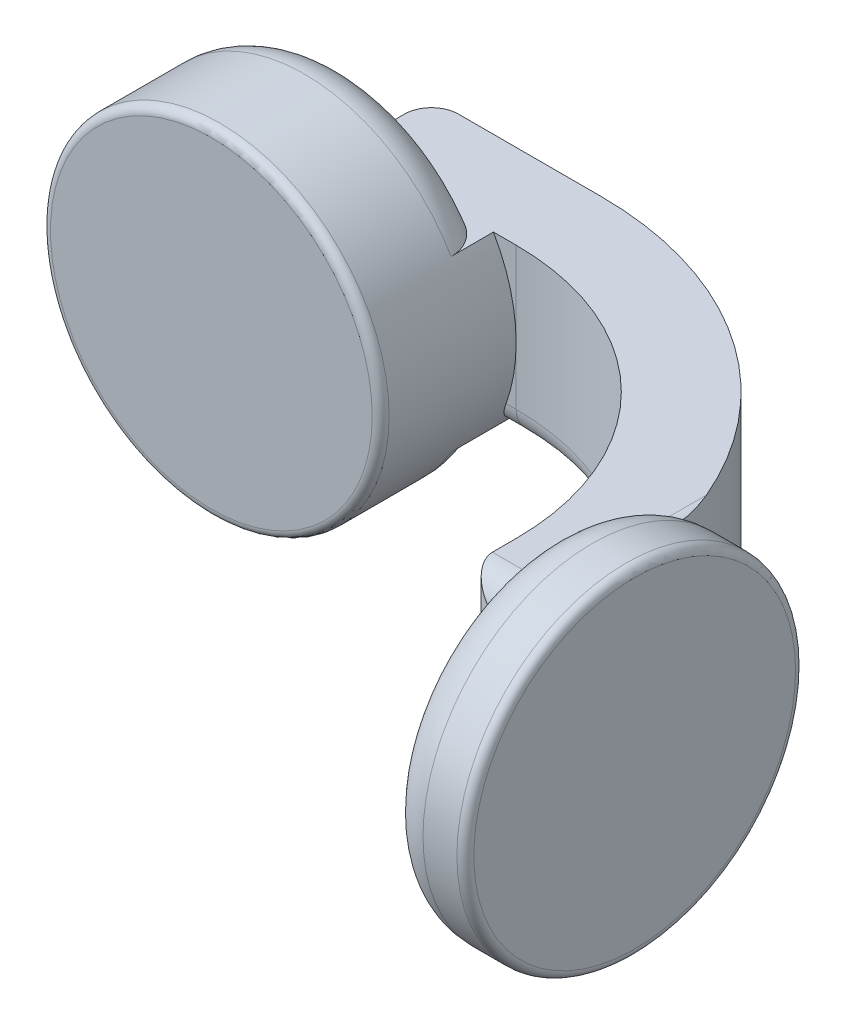
ISO-10303-21;
HEADER;
FILE_DESCRIPTION(('STEP AP214'),'2;1');
FILE_NAME('part.step','',(''),(''),'','','');
FILE_SCHEMA(('AUTOMOTIVE_DESIGN { 1 0 10303 214 1 1 1 1 }'));
ENDSEC;
DATA;
#1=APPLICATION_CONTEXT('core data for automotive mechanical design processes');
#2=APPLICATION_PROTOCOL_DEFINITION('international standard','automotive_design',2000,#1);
#3=PRODUCT_CONTEXT('',#1,'mechanical');
#4=PRODUCT('Part','Part','',(#3));
#5=PRODUCT_RELATED_PRODUCT_CATEGORY('part','',(#4));
#6=PRODUCT_DEFINITION_FORMATION('','',#4);
#7=PRODUCT_DEFINITION_CONTEXT('part definition',#1,'design');
#8=PRODUCT_DEFINITION('design','',#6,#7);
#9=PRODUCT_DEFINITION_SHAPE('','',#8);
#10=(LENGTH_UNIT() NAMED_UNIT(*) SI_UNIT(.MILLI.,.METRE.));
#11=(NAMED_UNIT(*) PLANE_ANGLE_UNIT() SI_UNIT($,.RADIAN.));
#12=(NAMED_UNIT(*) SI_UNIT($,.STERADIAN.) SOLID_ANGLE_UNIT());
#13=UNCERTAINTY_MEASURE_WITH_UNIT(LENGTH_MEASURE(1.E-05),#10,'distance_accuracy_value','');
#14=(GEOMETRIC_REPRESENTATION_CONTEXT(3) GLOBAL_UNCERTAINTY_ASSIGNED_CONTEXT((#13)) GLOBAL_UNIT_ASSIGNED_CONTEXT((#10,
#11,#12)) REPRESENTATION_CONTEXT('',''));
#15=CARTESIAN_POINT('',(0.,0.,0.));
#16=DIRECTION('',(0.,0.,1.));
#17=DIRECTION('',(1.,0.,0.));
#18=AXIS2_PLACEMENT_3D('',#15,#16,#17);
#19=CARTESIAN_POINT('',(0.,0.,0.));
#20=DIRECTION('',(0.,0.,1.));
#21=DIRECTION('',(1.,0.,0.));
#22=AXIS2_PLACEMENT_3D('',#19,#20,#21);
#23=PLANE('',#22);
#24=DIRECTION('',(1.,0.,0.));
#25=VECTOR('',#24,1.);
#26=CARTESIAN_POINT('',(10.,-5.,0.));
#27=LINE('',#26,#25);
#28=CARTESIAN_POINT('',(0.,-5.,0.));
#29=VERTEX_POINT('',#28);
#30=CARTESIAN_POINT('',(5.59016994374947,-5.,0.));
#31=VERTEX_POINT('',#30);
#32=EDGE_CURVE('E369',#29,#31,#27,.T.);
#33=ORIENTED_EDGE('',*,*,#32,.T.);
#34=CARTESIAN_POINT('',(0.,0.,0.));
#35=DIRECTION('',(0.,0.,1.));
#36=DIRECTION('',(1.,0.,0.));
#37=AXIS2_PLACEMENT_3D('',#34,#35,#36);
#38=CIRCLE('',#37,7.5);
#39=CARTESIAN_POINT('',(5.59016994374947,5.,0.));
#40=VERTEX_POINT('',#39);
#41=EDGE_CURVE('E384',#31,#40,#38,.F.);
#42=ORIENTED_EDGE('',*,*,#41,.T.);
#43=DIRECTION('',(1.,0.,0.));
#44=VECTOR('',#43,1.);
#45=CARTESIAN_POINT('',(10.,5.,0.));
#46=LINE('',#45,#44);
#47=CARTESIAN_POINT('',(0.,5.,0.));
#48=VERTEX_POINT('',#47);
#49=EDGE_CURVE('E191',#48,#40,#46,.T.);
#50=ORIENTED_EDGE('',*,*,#49,.F.);
#51=DIRECTION('',(0.,-1.,0.));
#52=VECTOR('',#51,1.);
#53=CARTESIAN_POINT('',(0.,5.,0.));
#54=LINE('',#53,#52);
#55=EDGE_CURVE('E395',#48,#29,#54,.T.);
#56=ORIENTED_EDGE('',*,*,#55,.T.);
#57=EDGE_LOOP('',(#33,#42,#50,#56));
#58=FACE_BOUND('',#57,.T.);
#59=ADVANCED_FACE('F45',(#58),#23,.F.);
#60=CARTESIAN_POINT('',(0.,0.,8.));
#61=DIRECTION('',(0.,0.,-1.));
#62=DIRECTION('',(-1.,0.,0.));
#63=AXIS2_PLACEMENT_3D('',#60,#61,#62);
#64=CYLINDRICAL_SURFACE('',#63,10.);
#65=CARTESIAN_POINT('',(0.,0.,7.5));
#66=DIRECTION('',(0.,0.,1.));
#67=DIRECTION('',(1.,0.,0.));
#68=AXIS2_PLACEMENT_3D('',#65,#66,#67);
#69=CIRCLE('',#68,10.);
#70=CARTESIAN_POINT('',(10.,0.,7.5));
#71=VERTEX_POINT('',#70);
#72=EDGE_CURVE('E482',#71,#71,#69,.F.);
#73=ORIENTED_EDGE('',*,*,#72,.T.);
#74=EDGE_LOOP('',(#73));
#75=FACE_BOUND('',#74,.T.);
#76=CARTESIAN_POINT('',(0.,0.,2.5));
#77=DIRECTION('',(0.,0.,1.));
#78=DIRECTION('',(1.,0.,0.));
#79=AXIS2_PLACEMENT_3D('',#76,#77,#78);
#80=CIRCLE('',#79,10.);
#81=CARTESIAN_POINT('',(8.66025403784439,5.,2.5));
#82=VERTEX_POINT('',#81);
#83=CARTESIAN_POINT('',(8.66025403784439,-5.,2.5));
#84=VERTEX_POINT('',#83);
#85=EDGE_CURVE('E382',#82,#84,#80,.T.);
#86=ORIENTED_EDGE('',*,*,#85,.T.);
#87=DIRECTION('',(0.,0.,-1.));
#88=VECTOR('',#87,1.);
#89=CARTESIAN_POINT('',(8.66025403784439,-5.,-1.6));
#90=LINE('',#89,#88);
#91=CARTESIAN_POINT('',(8.66025403784439,-5.,-1.6));
#92=VERTEX_POINT('',#91);
#93=EDGE_CURVE('E224',#92,#84,#90,.F.);
#94=ORIENTED_EDGE('',*,*,#93,.F.);
#95=CARTESIAN_POINT('',(8.66025403784439,-5.,-1.6));
#96=CARTESIAN_POINT('',(8.66025058169647,-5.00000266553729,-1.55887486618743));
#97=CARTESIAN_POINT('',(8.66117031444585,-4.9984132742453,-1.51777182963265));
#98=CARTESIAN_POINT('',(8.66481595063756,-4.99209221600678,-1.4359057856771));
#99=CARTESIAN_POINT('',(8.66754109183755,-4.98736187516532,-1.39514264212504));
#100=CARTESIAN_POINT('',(8.67832434041152,-4.96859184005911,-1.27421645717147));
#101=CARTESIAN_POINT('',(8.68899125727863,-4.94997202182349,-1.19494076642093));
#102=CARTESIAN_POINT('',(8.71646175302994,-4.90143425043169,-1.04125441294594));
#103=CARTESIAN_POINT('',(8.73325760344918,-4.87153052445072,-0.966837761786034));
#104=CARTESIAN_POINT('',(8.77188835727099,-4.80162123107177,-0.824262313424807));
#105=CARTESIAN_POINT('',(8.79372865329682,-4.76160484868106,-0.756110323065679));
#106=CARTESIAN_POINT('',(8.84275107076229,-4.66996936590311,-0.623218899185277));
#107=CARTESIAN_POINT('',(8.87018425017985,-4.61777505819111,-0.558970581843785));
#108=CARTESIAN_POINT('',(8.92801121418124,-4.50495689174365,-0.43991236217558));
#109=CARTESIAN_POINT('',(8.95840621253011,-4.44432957273975,-0.385106355027962));
#110=CARTESIAN_POINT('',(9.02473551105434,-4.3081949789312,-0.279593806323518));
#111=CARTESIAN_POINT('',(9.06089321781526,-4.23177472704241,-0.230203030543564));
#112=CARTESIAN_POINT('',(9.13383831521475,-4.07194398479078,-0.145114679299862));
#113=CARTESIAN_POINT('',(9.17062574000854,-3.98853311430253,-0.109417849054415));
#114=CARTESIAN_POINT('',(9.24115197100165,-3.82213169028326,-0.0543687952959192));
#115=CARTESIAN_POINT('',(9.27493486529865,-3.73945799539497,-0.0341143164682533));
#116=CARTESIAN_POINT('',(9.34097034296012,-3.57136092533112,-0.00692002501543537));
#117=CARTESIAN_POINT('',(9.37322286819497,-3.48593744591412,1.92822397724234E-05));
#118=CARTESIAN_POINT('',(9.404254356407,-3.4,0.));
#119=B_SPLINE_CURVE_WITH_KNOTS('',3,(#95,#96,#97,#98,#99,#100,#101,#102,#103,#104,#105,#106,
#107,#108,#109,#110,#111,#112,#113,#114,#115,#116,#117,#118),.UNSPECIFIED.,.F.,.F.,(4,2,2,2,2,2,
2,2,2,2,2,4),(0.,0.123291745203294,0.246531469851398,0.491603138959555,0.736366839400012,
0.981393418694913,1.24197132581496,1.50265647150607,1.79514368853533,2.08764682032895,
2.3613697328088,2.63510303408434),.UNSPECIFIED.);
#120=CARTESIAN_POINT('',(9.404254356407,-3.4,0.));
#121=VERTEX_POINT('',#120);
#122=EDGE_CURVE('E240',#92,#121,#119,.T.);
#123=ORIENTED_EDGE('',*,*,#122,.T.);
#124=CARTESIAN_POINT('',(0.,0.,0.));
#125=DIRECTION('',(0.,0.,1.));
#126=DIRECTION('',(1.,0.,0.));
#127=AXIS2_PLACEMENT_3D('',#124,#125,#126);
#128=CIRCLE('',#127,10.);
#129=CARTESIAN_POINT('',(10.,0.,0.));
#130=VERTEX_POINT('',#129);
#131=EDGE_CURVE('E207',#121,#130,#128,.T.);
#132=ORIENTED_EDGE('',*,*,#131,.T.);
#133=CARTESIAN_POINT('',(8.66025403784439,5.,0.));
#134=VERTEX_POINT('',#133);
#135=EDGE_CURVE('E205',#130,#134,#128,.T.);
#136=ORIENTED_EDGE('',*,*,#135,.T.);
#137=DIRECTION('',(0.,0.,-1.));
#138=VECTOR('',#137,1.);
#139=CARTESIAN_POINT('',(8.66025403784439,5.,0.));
#140=LINE('',#139,#138);
#141=EDGE_CURVE('E186',#134,#82,#140,.F.);
#142=ORIENTED_EDGE('',*,*,#141,.T.);
#143=EDGE_LOOP('',(#86,#94,#123,#132,#136,#142));
#144=FACE_BOUND('',#143,.T.);
#145=ADVANCED_FACE('F251',(#75,#144),#64,.T.);
#146=CARTESIAN_POINT('',(0.,0.,8.));
#147=DIRECTION('',(0.,0.,1.));
#148=DIRECTION('',(1.,0.,0.));
#149=AXIS2_PLACEMENT_3D('',#146,#147,#148);
#150=PLANE('',#149);
#151=CARTESIAN_POINT('',(0.,0.,8.));
#152=DIRECTION('',(0.,0.,1.));
#153=DIRECTION('',(1.,0.,0.));
#154=AXIS2_PLACEMENT_3D('',#151,#152,#153);
#155=CIRCLE('',#154,9.5);
#156=CARTESIAN_POINT('',(9.5,0.,8.));
#157=VERTEX_POINT('',#156);
#158=EDGE_CURVE('E877',#157,#157,#155,.T.);
#159=ORIENTED_EDGE('',*,*,#158,.T.);
#160=EDGE_LOOP('',(#159));
#161=FACE_BOUND('',#160,.T.);
#162=ADVANCED_FACE('F508',(#161),#150,.T.);
#163=CARTESIAN_POINT('',(10.,5.,0.));
#164=DIRECTION('',(0.,0.,-1.));
#165=DIRECTION('',(-1.,0.,0.));
#166=AXIS2_PLACEMENT_3D('',#163,#164,#165);
#167=PLANE('',#166);
#168=CARTESIAN_POINT('',(10.,5.,0.));
#169=VERTEX_POINT('',#168);
#170=EDGE_CURVE('E179',#134,#169,#46,.T.);
#171=ORIENTED_EDGE('',*,*,#170,.F.);
#172=ORIENTED_EDGE('',*,*,#135,.F.);
#173=DIRECTION('',(0.,-1.,0.));
#174=VECTOR('',#173,1.);
#175=CARTESIAN_POINT('',(10.,5.,0.));
#176=LINE('',#175,#174);
#177=EDGE_CURVE('E198',#169,#130,#176,.T.);
#178=ORIENTED_EDGE('',*,*,#177,.F.);
#179=EDGE_LOOP('',(#171,#172,#178));
#180=FACE_BOUND('',#179,.T.);
#181=ADVANCED_FACE('F204',(#180),#167,.F.);
#182=ORIENTED_EDGE('',*,*,#131,.F.);
#183=DIRECTION('',(1.,0.,0.));
#184=VECTOR('',#183,1.);
#185=CARTESIAN_POINT('',(10.,-3.4,0.));
#186=LINE('',#185,#184);
#187=CARTESIAN_POINT('',(10.,-3.4,0.));
#188=VERTEX_POINT('',#187);
#189=EDGE_CURVE('E214',#121,#188,#186,.T.);
#190=ORIENTED_EDGE('',*,*,#189,.T.);
#191=EDGE_CURVE('E208',#130,#188,#176,.T.);
#192=ORIENTED_EDGE('',*,*,#191,.F.);
#193=EDGE_LOOP('',(#182,#190,#192));
#194=FACE_BOUND('',#193,.T.);
#195=ADVANCED_FACE('F401',(#194),#167,.F.);
#196=CARTESIAN_POINT('',(10.,5.,15.));
#197=DIRECTION('',(0.,-1.,0.));
#198=DIRECTION('',(0.,0.,-1.));
#199=AXIS2_PLACEMENT_3D('',#196,#197,#198);
#200=CYLINDRICAL_SURFACE('',#199,15.);
#201=ORIENTED_EDGE('',*,*,#191,.T.);
#202=CARTESIAN_POINT('',(10.,-3.4,15.));
#203=DIRECTION('',(0.,-1.,0.));
#204=DIRECTION('',(0.,0.,-1.));
#205=AXIS2_PLACEMENT_3D('',#202,#203,#204);
#206=CIRCLE('',#205,15.);
#207=CARTESIAN_POINT('',(25.,-3.4,15.));
#208=VERTEX_POINT('',#207);
#209=EDGE_CURVE('E238',#188,#208,#206,.T.);
#210=ORIENTED_EDGE('',*,*,#209,.T.);
#211=DIRECTION('',(0.,-1.,0.));
#212=VECTOR('',#211,1.);
#213=CARTESIAN_POINT('',(25.,5.,15.));
#214=LINE('',#213,#212);
#215=CARTESIAN_POINT('',(25.,5.,15.));
#216=VERTEX_POINT('',#215);
#217=EDGE_CURVE('E200',#216,#208,#214,.T.);
#218=ORIENTED_EDGE('',*,*,#217,.F.);
#219=CARTESIAN_POINT('',(10.,5.,15.));
#220=DIRECTION('',(0.,-1.,0.));
#221=DIRECTION('',(0.,0.,1.));
#222=AXIS2_PLACEMENT_3D('',#219,#220,#221);
#223=CIRCLE('',#222,15.);
#224=EDGE_CURVE('E183',#169,#216,#223,.T.);
#225=ORIENTED_EDGE('',*,*,#224,.F.);
#226=ORIENTED_EDGE('',*,*,#177,.T.);
#227=EDGE_LOOP('',(#201,#210,#218,#225,#226));
#228=FACE_BOUND('',#227,.T.);
#229=ADVANCED_FACE('F197',(#228),#200,.F.);
#230=CARTESIAN_POINT('',(25.,5.,18.));
#231=DIRECTION('',(1.,0.,0.));
#232=DIRECTION('',(0.,0.,-1.));
#233=AXIS2_PLACEMENT_3D('',#230,#231,#232);
#234=PLANE('',#233);
#235=DIRECTION('',(0.,0.,1.));
#236=VECTOR('',#235,1.);
#237=CARTESIAN_POINT('',(25.,-3.4,18.));
#238=LINE('',#237,#236);
#239=CARTESIAN_POINT('',(25.,-3.4,16.4));
#240=VERTEX_POINT('',#239);
#241=EDGE_CURVE('E228',#208,#240,#238,.T.);
#242=ORIENTED_EDGE('',*,*,#241,.T.);
#243=DIRECTION('',(0.,-1.,0.));
#244=VECTOR('',#243,1.);
#245=CARTESIAN_POINT('',(25.,5.,16.4));
#246=LINE('',#245,#244);
#247=CARTESIAN_POINT('',(25.,5.,16.4));
#248=VERTEX_POINT('',#247);
#249=EDGE_CURVE('E415',#240,#248,#246,.F.);
#250=ORIENTED_EDGE('',*,*,#249,.T.);
#251=DIRECTION('',(0.,0.,1.));
#252=VECTOR('',#251,1.);
#253=CARTESIAN_POINT('',(25.,5.,18.));
#254=LINE('',#253,#252);
#255=EDGE_CURVE('E202',#216,#248,#254,.T.);
#256=ORIENTED_EDGE('',*,*,#255,.F.);
#257=ORIENTED_EDGE('',*,*,#217,.T.);
#258=EDGE_LOOP('',(#242,#250,#256,#257));
#259=FACE_BOUND('',#258,.T.);
#260=ADVANCED_FACE('F404',(#259),#234,.F.);
#261=CARTESIAN_POINT('',(30.,5.,18.));
#262=DIRECTION('',(0.,0.,-1.));
#263=DIRECTION('',(-1.,0.,0.));
#264=AXIS2_PLACEMENT_3D('',#261,#262,#263);
#265=PLANE('',#264);
#266=DIRECTION('',(1.,0.,0.));
#267=VECTOR('',#266,1.);
#268=CARTESIAN_POINT('',(30.,3.4,18.));
#269=LINE('',#268,#267);
#270=CARTESIAN_POINT('',(28.4,3.4,18.));
#271=VERTEX_POINT('',#270);
#272=CARTESIAN_POINT('',(26.6,3.4,18.));
#273=VERTEX_POINT('',#272);
#274=EDGE_CURVE('E474',#271,#273,#269,.F.);
#275=ORIENTED_EDGE('',*,*,#274,.T.);
#276=DIRECTION('',(0.,-1.,0.));
#277=VECTOR('',#276,1.);
#278=CARTESIAN_POINT('',(26.6,5.,18.));
#279=LINE('',#278,#277);
#280=CARTESIAN_POINT('',(26.6,-3.4,18.));
#281=VERTEX_POINT('',#280);
#282=EDGE_CURVE('E419',#273,#281,#279,.T.);
#283=ORIENTED_EDGE('',*,*,#282,.T.);
#284=DIRECTION('',(1.,0.,0.));
#285=VECTOR('',#284,1.);
#286=CARTESIAN_POINT('',(30.,-3.4,18.));
#287=LINE('',#286,#285);
#288=CARTESIAN_POINT('',(28.4,-3.4,18.));
#289=VERTEX_POINT('',#288);
#290=EDGE_CURVE('E478',#281,#289,#287,.T.);
#291=ORIENTED_EDGE('',*,*,#290,.T.);
#292=DIRECTION('',(0.,-1.,0.));
#293=VECTOR('',#292,1.);
#294=CARTESIAN_POINT('',(28.4,5.,18.));
#295=LINE('',#294,#293);
#296=EDGE_CURVE('E479',#289,#271,#295,.F.);
#297=ORIENTED_EDGE('',*,*,#296,.T.);
#298=EDGE_LOOP('',(#275,#283,#291,#297));
#299=FACE_BOUND('',#298,.T.);
#300=ADVANCED_FACE('F324',(#299),#265,.F.);
#301=CARTESIAN_POINT('',(10.,5.,15.));
#302=DIRECTION('',(0.,-1.,0.));
#303=DIRECTION('',(0.,0.,-1.));
#304=AXIS2_PLACEMENT_3D('',#301,#302,#303);
#305=CYLINDRICAL_SURFACE('',#304,20.);
#306=DIRECTION('',(0.,-1.,0.));
#307=VECTOR('',#306,1.);
#308=CARTESIAN_POINT('',(30.,5.,15.));
#309=LINE('',#308,#307);
#310=CARTESIAN_POINT('',(30.,6.6,15.));
#311=VERTEX_POINT('',#310);
#312=CARTESIAN_POINT('',(30.,-6.6,15.));
#313=VERTEX_POINT('',#312);
#314=EDGE_CURVE('E407',#311,#313,#309,.T.);
#315=ORIENTED_EDGE('',*,*,#314,.T.);
#316=CARTESIAN_POINT('',(28.4,-5.,7.16163282309384));
#317=CARTESIAN_POINT('',(28.4530484699294,-5.00002068483299,7.286155366446));
#318=CARTESIAN_POINT('',(28.5048200993728,-5.00263727314712,7.41119605520283));
#319=CARTESIAN_POINT('',(28.605742286896,-5.01246853776342,7.66211109644269));
#320=CARTESIAN_POINT('',(28.6548936310212,-5.01968182661868,7.78798518603461));
#321=CARTESIAN_POINT('',(28.7504717643221,-5.03810036501447,8.04025981820502));
#322=CARTESIAN_POINT('',(28.7969023370756,-5.04929990997424,8.16665935467843));
#323=CARTESIAN_POINT('',(28.8870956091202,-5.0752249020843,8.42005250289731));
#324=CARTESIAN_POINT('',(28.9308580760043,-5.08995065583822,8.54704616536004));
#325=CARTESIAN_POINT('',(29.0578700419348,-5.13869005956199,8.92800714384153));
#326=CARTESIAN_POINT('',(29.1371368543709,-5.17732758481859,9.18272806205544));
#327=CARTESIAN_POINT('',(29.285059588997,-5.26432532093026,9.69365649505783));
#328=CARTESIAN_POINT('',(29.3537103002799,-5.3126902798639,9.94986467625656));
#329=CARTESIAN_POINT('',(29.5144255660816,-5.44502383097576,10.6008999398467));
#330=CARTESIAN_POINT('',(29.5993328896146,-5.5341860957001,10.9964626006848));
#331=CARTESIAN_POINT('',(29.7446756716351,-5.72467494915188,11.7890387753721));
#332=CARTESIAN_POINT('',(29.8051060263866,-5.82600406910742,12.1860525744055));
#333=CARTESIAN_POINT('',(29.9502596230999,-6.14143093440387,13.3787422174128));
#334=CARTESIAN_POINT('',(29.9988979049005,-6.36701704803795,14.1762812374318));
#335=CARTESIAN_POINT('',(29.9999938236233,-6.59486805700754,14.9818557642076));
#336=CARTESIAN_POINT('',(29.9999999961886,-6.59743405958099,14.9909279519622));
#337=CARTESIAN_POINT('',(30.,-6.6,15.));
#338=B_SPLINE_CURVE_WITH_KNOTS('',3,(#316,#317,#318,#319,#320,#321,#322,#323,#324,#325,#326,
#327,#328,#329,#330,#331,#332,#333,#334,#335,#336,#337),.UNSPECIFIED.,.F.,.F.,(4,2,2,2,2,2,2,2,
2,2,4),(0.,0.405988217514378,0.811853951420562,1.21714118612728,1.62246367333657,
2.43062470155256,3.23918116453678,4.48086558408027,5.72280877632142,8.20601964192417,
8.23430391923559),.UNSPECIFIED.);
#339=CARTESIAN_POINT('',(28.4,-5.,7.16163282309384));
#340=VERTEX_POINT('',#339);
#341=EDGE_CURVE('E11',#313,#340,#338,.F.);
#342=ORIENTED_EDGE('',*,*,#341,.T.);
#343=CARTESIAN_POINT('',(10.,-5.,15.));
#344=DIRECTION('',(0.,1.,0.));
#345=DIRECTION('',(0.,0.,-1.));
#346=AXIS2_PLACEMENT_3D('',#343,#344,#345);
#347=CIRCLE('',#346,20.);
#348=CARTESIAN_POINT('',(10.,-5.,-5.));
#349=VERTEX_POINT('',#348);
#350=EDGE_CURVE('E373',#340,#349,#347,.T.);
#351=ORIENTED_EDGE('',*,*,#350,.T.);
#352=DIRECTION('',(0.,-1.,0.));
#353=VECTOR('',#352,1.);
#354=CARTESIAN_POINT('',(10.,5.,-5.));
#355=LINE('',#354,#353);
#356=CARTESIAN_POINT('',(10.,5.,-5.));
#357=VERTEX_POINT('',#356);
#358=EDGE_CURVE('E450',#357,#349,#355,.T.);
#359=ORIENTED_EDGE('',*,*,#358,.F.);
#360=CARTESIAN_POINT('',(10.,5.,15.));
#361=DIRECTION('',(0.,1.,0.));
#362=DIRECTION('',(0.,0.,-1.));
#363=AXIS2_PLACEMENT_3D('',#360,#361,#362);
#364=CIRCLE('',#363,20.);
#365=CARTESIAN_POINT('',(28.4,5.,7.16163282309384));
#366=VERTEX_POINT('',#365);
#367=EDGE_CURVE('E442',#366,#357,#364,.T.);
#368=ORIENTED_EDGE('',*,*,#367,.F.);
#369=CARTESIAN_POINT('',(28.4,5.,7.16163282309384));
#370=CARTESIAN_POINT('',(28.4530484699293,5.00002068483299,7.28615536644588));
#371=CARTESIAN_POINT('',(28.5048200993727,5.00263727314711,7.41119605520257));
#372=CARTESIAN_POINT('',(28.6057422868958,5.01246853776339,7.66211109644217));
#373=CARTESIAN_POINT('',(28.6548936310209,5.01968182661864,7.78798518603396));
#374=CARTESIAN_POINT('',(28.7504717643218,5.0381003650144,8.04025981820415));
#375=CARTESIAN_POINT('',(28.7969023370753,5.04929990997414,8.16665935467745));
#376=CARTESIAN_POINT('',(28.8870956091198,5.07522490208417,8.42005250289612));
#377=CARTESIAN_POINT('',(28.9308580760039,5.08995065583807,8.54704616535875));
#378=CARTESIAN_POINT('',(29.0578700419345,5.13869005956181,8.92800714384038));
#379=CARTESIAN_POINT('',(29.1371368543707,5.17732758481843,9.18272806205453));
#380=CARTESIAN_POINT('',(29.2850595889969,5.26432532093019,9.69365649505739));
#381=CARTESIAN_POINT('',(29.3537103002799,5.31269027986392,9.94986467625632));
#382=CARTESIAN_POINT('',(29.5144255660816,5.44502383097565,10.6008999398467));
#383=CARTESIAN_POINT('',(29.5993328896146,5.53418609569961,10.996462600685));
#384=CARTESIAN_POINT('',(29.7446756716351,5.72467494915242,11.7890387753722));
#385=CARTESIAN_POINT('',(29.8051060263866,5.82600406910935,12.1860525744053));
#386=CARTESIAN_POINT('',(29.9502596230999,6.14143093440022,13.3787422174142));
#387=CARTESIAN_POINT('',(29.9988979049005,6.36701704801761,14.1762812374377));
#388=CARTESIAN_POINT('',(29.9999938236233,6.59486805700707,14.9818557642077));
#389=CARTESIAN_POINT('',(29.9999999961886,6.59743405958075,14.9909279519623));
#390=CARTESIAN_POINT('',(30.,6.6,15.));
#391=B_SPLINE_CURVE_WITH_KNOTS('',3,(#369,#370,#371,#372,#373,#374,#375,#376,#377,#378,#379,
#380,#381,#382,#383,#384,#385,#386,#387,#388,#389,#390),.UNSPECIFIED.,.F.,.F.,(4,2,2,2,2,2,2,2,
2,2,4),(0.,0.405988217513961,0.81185395141973,1.21714118612612,1.62246367333509,
2.43062470155186,3.23918116453678,4.4808655840804,5.72280877632186,8.20601964192418,
8.23430391923559),.UNSPECIFIED.);
#392=EDGE_CURVE('E55',#366,#311,#391,.T.);
#393=ORIENTED_EDGE('',*,*,#392,.T.);
#394=EDGE_LOOP('',(#315,#342,#351,#359,#368,#393));
#395=FACE_BOUND('',#394,.T.);
#396=ADVANCED_FACE('F319',(#395),#305,.T.);
#397=CARTESIAN_POINT('',(0.,5.,-5.));
#398=DIRECTION('',(0.,0.,1.));
#399=DIRECTION('',(1.,0.,0.));
#400=AXIS2_PLACEMENT_3D('',#397,#398,#399);
#401=PLANE('',#400);
#402=DIRECTION('',(-1.,0.,0.));
#403=VECTOR('',#402,1.);
#404=CARTESIAN_POINT('',(0.,-5.,-5.));
#405=LINE('',#404,#403);
#406=CARTESIAN_POINT('',(1.6,-5.,-5.));
#407=VERTEX_POINT('',#406);
#408=EDGE_CURVE('E457',#349,#407,#405,.T.);
#409=ORIENTED_EDGE('',*,*,#408,.T.);
#410=DIRECTION('',(0.,-1.,0.));
#411=VECTOR('',#410,1.);
#412=CARTESIAN_POINT('',(1.6,5.,-5.));
#413=LINE('',#412,#411);
#414=CARTESIAN_POINT('',(1.6,5.,-5.));
#415=VERTEX_POINT('',#414);
#416=EDGE_CURVE('E234',#407,#415,#413,.F.);
#417=ORIENTED_EDGE('',*,*,#416,.T.);
#418=DIRECTION('',(-1.,0.,0.));
#419=VECTOR('',#418,1.);
#420=CARTESIAN_POINT('',(0.,5.,-5.));
#421=LINE('',#420,#419);
#422=EDGE_CURVE('E462',#357,#415,#421,.T.);
#423=ORIENTED_EDGE('',*,*,#422,.F.);
#424=ORIENTED_EDGE('',*,*,#358,.T.);
#425=EDGE_LOOP('',(#409,#417,#423,#424));
#426=FACE_BOUND('',#425,.T.);
#427=ADVANCED_FACE('F315',(#426),#401,.F.);
#428=CARTESIAN_POINT('',(0.,5.,0.));
#429=DIRECTION('',(1.,0.,0.));
#430=DIRECTION('',(0.,0.,-1.));
#431=AXIS2_PLACEMENT_3D('',#428,#429,#430);
#432=PLANE('',#431);
#433=DIRECTION('',(0.,0.,1.));
#434=VECTOR('',#433,1.);
#435=CARTESIAN_POINT('',(0.,5.,0.));
#436=LINE('',#435,#434);
#437=CARTESIAN_POINT('',(0.,5.,-3.4));
#438=VERTEX_POINT('',#437);
#439=EDGE_CURVE('E455',#438,#48,#436,.T.);
#440=ORIENTED_EDGE('',*,*,#439,.F.);
#441=DIRECTION('',(0.,-1.,0.));
#442=VECTOR('',#441,1.);
#443=CARTESIAN_POINT('',(0.,5.,-3.4));
#444=LINE('',#443,#442);
#445=CARTESIAN_POINT('',(0.,-5.,-3.4));
#446=VERTEX_POINT('',#445);
#447=EDGE_CURVE('E231',#438,#446,#444,.T.);
#448=ORIENTED_EDGE('',*,*,#447,.T.);
#449=DIRECTION('',(0.,0.,1.));
#450=VECTOR('',#449,1.);
#451=CARTESIAN_POINT('',(0.,-5.,0.));
#452=LINE('',#451,#450);
#453=EDGE_CURVE('E192',#446,#29,#452,.T.);
#454=ORIENTED_EDGE('',*,*,#453,.T.);
#455=ORIENTED_EDGE('',*,*,#55,.F.);
#456=EDGE_LOOP('',(#440,#448,#454,#455));
#457=FACE_BOUND('',#456,.T.);
#458=ADVANCED_FACE('F306',(#457),#432,.F.);
#459=CARTESIAN_POINT('',(10.,5.,15.));
#460=DIRECTION('',(0.,-1.,0.));
#461=DIRECTION('',(0.,0.,-1.));
#462=AXIS2_PLACEMENT_3D('',#459,#460,#461);
#463=PLANE('',#462);
#464=DIRECTION('',(1.,0.,0.));
#465=VECTOR('',#464,1.);
#466=CARTESIAN_POINT('',(10.,5.,16.4));
#467=LINE('',#466,#465);
#468=CARTESIAN_POINT('',(28.4,5.,16.4));
#469=VERTEX_POINT('',#468);
#470=EDGE_CURVE('E414',#248,#469,#467,.T.);
#471=ORIENTED_EDGE('',*,*,#470,.T.);
#472=DIRECTION('',(0.,0.,-1.));
#473=VECTOR('',#472,1.);
#474=CARTESIAN_POINT('',(28.4,5.,15.));
#475=LINE('',#474,#473);
#476=EDGE_CURVE('E417',#469,#366,#475,.T.);
#477=ORIENTED_EDGE('',*,*,#476,.T.);
#478=ORIENTED_EDGE('',*,*,#367,.T.);
#479=ORIENTED_EDGE('',*,*,#422,.T.);
#480=CARTESIAN_POINT('',(1.6,5.,-3.4));
#481=DIRECTION('',(0.,-1.,0.));
#482=DIRECTION('',(0.,0.,-1.));
#483=AXIS2_PLACEMENT_3D('',#480,#481,#482);
#484=CIRCLE('',#483,1.6);
#485=EDGE_CURVE('E236',#415,#438,#484,.F.);
#486=ORIENTED_EDGE('',*,*,#485,.T.);
#487=ORIENTED_EDGE('',*,*,#439,.T.);
#488=ORIENTED_EDGE('',*,*,#49,.T.);
#489=CARTESIAN_POINT('',(5.59016994374947,5.,0.));
#490=CARTESIAN_POINT('',(5.69559570213901,5.,-3.21128395362892E-06));
#491=CARTESIAN_POINT('',(5.8010668001103,5.,0.00370605417629882));
#492=CARTESIAN_POINT('',(6.01159130499684,5.,0.0191030697602009));
#493=CARTESIAN_POINT('',(6.11664374472977,5.,0.0308038789064032));
#494=CARTESIAN_POINT('',(6.32615051348612,5.,0.0628447523994929));
#495=CARTESIAN_POINT('',(6.43059653317389,5.,0.083240404691087));
#496=CARTESIAN_POINT('',(6.63727851966114,5.,0.133165897095988));
#497=CARTESIAN_POINT('',(6.73951448816319,5.,0.162695730172267));
#498=CARTESIAN_POINT('',(6.99574367042443,5.,0.250076830269065));
#499=CARTESIAN_POINT('',(7.14754171064708,5.,0.314589824467287));
#500=CARTESIAN_POINT('',(7.43846424543668,5.,0.467361153468645));
#501=CARTESIAN_POINT('',(7.57761868370115,5.,0.555561318798945));
#502=CARTESIAN_POINT('',(7.77342472626838,5.,0.705814499331195));
#503=CARTESIAN_POINT('',(7.83683094175478,5.,0.759212422291435));
#504=CARTESIAN_POINT('',(7.95829427447273,5.,0.87176047625062));
#505=CARTESIAN_POINT('',(8.0163542275839,5.,0.930907523047585));
#506=CARTESIAN_POINT('',(8.12637776396663,5.,1.05467929625632));
#507=CARTESIAN_POINT('',(8.17833846827036,5.,1.11930658485993));
#508=CARTESIAN_POINT('',(8.27534897295878,5.,1.25355277952864));
#509=CARTESIAN_POINT('',(8.32040036639133,5.,1.32317052951775));
#510=CARTESIAN_POINT('',(8.39709299209857,5.,1.45674746176264));
#511=CARTESIAN_POINT('',(8.42972845977946,5.,1.52013741970397));
#512=CARTESIAN_POINT('',(8.48892006560263,5.,1.64969053965642));
#513=CARTESIAN_POINT('',(8.51547728789676,5.,1.71585320461642));
#514=CARTESIAN_POINT('',(8.56210510727751,5.,1.85028220088857));
#515=CARTESIAN_POINT('',(8.58218827909303,5.,1.91854416855295));
#516=CARTESIAN_POINT('',(8.61564239864842,5.,2.05666093443894));
#517=CARTESIAN_POINT('',(8.629017331075,5.,2.12651476125467));
#518=CARTESIAN_POINT('',(8.64603565181045,5.,2.24707957945499));
#519=CARTESIAN_POINT('',(8.65136757072377,5.,2.29755838810805));
#520=CARTESIAN_POINT('',(8.65847592976435,5.,2.3986891887865));
#521=CARTESIAN_POINT('',(8.66025770820604,5.,2.44934080589065));
#522=CARTESIAN_POINT('',(8.66025403784439,5.,2.5));
#523=B_SPLINE_CURVE_WITH_KNOTS('',3,(#489,#490,#491,#492,#493,#494,#495,#496,#497,#498,#499,
#500,#501,#502,#503,#504,#505,#506,#507,#508,#509,#510,#511,#512,#513,#514,#515,#516,#517,#518,
#519,#520,#521,#522),.UNSPECIFIED.,.F.,.F.,(4,2,2,2,2,2,2,2,2,2,2,2,2,2,2,2,4),(0.,
0.316278424118014,0.633074920901962,0.951927875518976,1.27078058449038,1.76360140484387,
2.2552228812992,2.50359876259714,2.751842126779,3.00020219958862,3.24850492279669,
3.46210068110813,3.6756583114726,3.8887986080095,4.1018121490612,4.25397276909149,
4.40590441336332),.UNSPECIFIED.);
#524=EDGE_CURVE('E293',#40,#82,#523,.T.);
#525=ORIENTED_EDGE('',*,*,#524,.T.);
#526=ORIENTED_EDGE('',*,*,#141,.F.);
#527=ORIENTED_EDGE('',*,*,#170,.T.);
#528=ORIENTED_EDGE('',*,*,#224,.T.);
#529=ORIENTED_EDGE('',*,*,#255,.T.);
#530=EDGE_LOOP('',(#471,#477,#478,#479,#486,#487,#488,#525,#526,#527,#528,#529));
#531=FACE_BOUND('',#530,.T.);
#532=ADVANCED_FACE('F181',(#531),#463,.F.);
#533=CARTESIAN_POINT('',(10.,-5.,15.));
#534=DIRECTION('',(0.,-1.,0.));
#535=DIRECTION('',(0.,0.,-1.));
#536=AXIS2_PLACEMENT_3D('',#533,#534,#535);
#537=PLANE('',#536);
#538=ORIENTED_EDGE('',*,*,#350,.F.);
#539=DIRECTION('',(0.,0.,-1.));
#540=VECTOR('',#539,1.);
#541=CARTESIAN_POINT('',(28.4,-5.,15.));
#542=LINE('',#541,#540);
#543=CARTESIAN_POINT('',(28.4,-5.,16.4));
#544=VERTEX_POINT('',#543);
#545=EDGE_CURVE('E63',#340,#544,#542,.F.);
#546=ORIENTED_EDGE('',*,*,#545,.T.);
#547=DIRECTION('',(1.,0.,0.));
#548=VECTOR('',#547,1.);
#549=CARTESIAN_POINT('',(26.6,-5.,16.4));
#550=LINE('',#549,#548);
#551=CARTESIAN_POINT('',(26.6,-5.,16.4));
#552=VERTEX_POINT('',#551);
#553=EDGE_CURVE('E436',#544,#552,#550,.F.);
#554=ORIENTED_EDGE('',*,*,#553,.T.);
#555=DIRECTION('',(0.,0.,1.));
#556=VECTOR('',#555,1.);
#557=CARTESIAN_POINT('',(26.6,-5.,15.));
#558=LINE('',#557,#556);
#559=CARTESIAN_POINT('',(26.6,-5.,15.));
#560=VERTEX_POINT('',#559);
#561=EDGE_CURVE('E219',#552,#560,#558,.F.);
#562=ORIENTED_EDGE('',*,*,#561,.T.);
#563=CARTESIAN_POINT('',(10.,-5.,15.));
#564=DIRECTION('',(0.,-1.,0.));
#565=DIRECTION('',(0.,0.,-1.));
#566=AXIS2_PLACEMENT_3D('',#563,#564,#565);
#567=CIRCLE('',#566,16.6);
#568=CARTESIAN_POINT('',(10.,-5.,-1.6));
#569=VERTEX_POINT('',#568);
#570=EDGE_CURVE('E217',#560,#569,#567,.F.);
#571=ORIENTED_EDGE('',*,*,#570,.T.);
#572=DIRECTION('',(1.,0.,0.));
#573=VECTOR('',#572,1.);
#574=CARTESIAN_POINT('',(8.66025403784439,-5.,-1.6));
#575=LINE('',#574,#573);
#576=EDGE_CURVE('E221',#569,#92,#575,.F.);
#577=ORIENTED_EDGE('',*,*,#576,.T.);
#578=ORIENTED_EDGE('',*,*,#93,.T.);
#579=CARTESIAN_POINT('',(8.66025403784439,-5.,2.5));
#580=CARTESIAN_POINT('',(8.66026483120436,-5.,2.43696693757109));
#581=CARTESIAN_POINT('',(8.65750159739673,-5.,2.37393912745903));
#582=CARTESIAN_POINT('',(8.64650978637162,-5.,2.2483778402883));
#583=CARTESIAN_POINT('',(8.63828263165101,-5.,2.18584423885221));
#584=CARTESIAN_POINT('',(8.61648595091632,-5.,2.06195120020972));
#585=CARTESIAN_POINT('',(8.6029362756272,-5.,2.00058827845841));
#586=CARTESIAN_POINT('',(8.57066368222261,-5.,1.87925452588913));
#587=CARTESIAN_POINT('',(8.55194062308016,-5.,1.81928373306904));
#588=CARTESIAN_POINT('',(8.48831980386789,-5.,1.64215195299143));
#589=CARTESIAN_POINT('',(8.43593771489012,-5.,1.52758920910239));
#590=CARTESIAN_POINT('',(8.313419606048,-5.,1.3084306205645));
#591=CARTESIAN_POINT('',(8.24327115871853,-5.,1.20384182341904));
#592=CARTESIAN_POINT('',(8.08463898524759,-5.,1.00260818053831));
#593=CARTESIAN_POINT('',(7.99552267609551,-5.,0.906463219420349));
#594=CARTESIAN_POINT('',(7.80402676580102,-5.,0.728613644951013));
#595=CARTESIAN_POINT('',(7.7016490209875,-5.,0.646907014307002));
#596=CARTESIAN_POINT('',(7.47362723792491,-5.,0.489565289916245));
#597=CARTESIAN_POINT('',(7.34666590837708,-5.,0.415843516793151));
#598=CARTESIAN_POINT('',(7.08338458849326,-5.,0.287071513921496));
#599=CARTESIAN_POINT('',(6.94704278615458,-5.,0.23206669997405));
#600=CARTESIAN_POINT('',(6.61136979505112,-5.,0.121414460623506));
#601=CARTESIAN_POINT('',(6.40905878186099,-5.,0.0746830095373594));
#602=CARTESIAN_POINT('',(6.10287671465111,-5.,0.0291711304381454));
#603=CARTESIAN_POINT('',(6.00057058565453,-5.,0.0180958152616953));
#604=CARTESIAN_POINT('',(5.79557541058253,-5.,0.00352182696051356));
#605=CARTESIAN_POINT('',(5.69288722457602,-5.,1.12139899121938E-05));
#606=CARTESIAN_POINT('',(5.59016994374947,-5.,0.));
#607=B_SPLINE_CURVE_WITH_KNOTS('',3,(#579,#580,#581,#582,#583,#584,#585,#586,#587,#588,#589,
#590,#591,#592,#593,#594,#595,#596,#597,#598,#599,#600,#601,#602,#603,#604,#605,#606),
.UNSPECIFIED.,.F.,.F.,(4,2,2,2,2,2,2,2,2,2,2,2,2,4),(0.,0.189029762232949,0.378010331057441,
0.566292674827834,0.754580151701197,1.13060641553637,1.50689643754924,1.8985771734559,
2.29020314122469,2.72894854688963,3.16875107989925,3.78821000906057,4.09670884091868,
4.40472039189046),.UNSPECIFIED.);
#608=EDGE_CURVE('E285',#84,#31,#607,.T.);
#609=ORIENTED_EDGE('',*,*,#608,.T.);
#610=ORIENTED_EDGE('',*,*,#32,.F.);
#611=ORIENTED_EDGE('',*,*,#453,.F.);
#612=CARTESIAN_POINT('',(1.6,-5.,-3.4));
#613=DIRECTION('',(0.,-1.,0.));
#614=DIRECTION('',(0.,0.,-1.));
#615=AXIS2_PLACEMENT_3D('',#612,#613,#614);
#616=CIRCLE('',#615,1.6);
#617=EDGE_CURVE('E226',#446,#407,#616,.T.);
#618=ORIENTED_EDGE('',*,*,#617,.T.);
#619=ORIENTED_EDGE('',*,*,#408,.F.);
#620=EDGE_LOOP('',(#538,#546,#554,#562,#571,#577,#578,#609,#610,#611,#618,#619));
#621=FACE_BOUND('',#620,.T.);
#622=ADVANCED_FACE('F305',(#621),#537,.T.);
#623=CARTESIAN_POINT('',(30.,0.,18.));
#624=DIRECTION('',(1.,0.,0.));
#625=DIRECTION('',(0.,0.,-1.));
#626=AXIS2_PLACEMENT_3D('',#623,#624,#625);
#627=PLANE('',#626);
#628=CARTESIAN_POINT('',(30.,0.,18.));
#629=DIRECTION('',(1.,0.,0.));
#630=DIRECTION('',(0.,0.,-1.));
#631=AXIS2_PLACEMENT_3D('',#628,#629,#630);
#632=CIRCLE('',#631,7.5);
#633=CARTESIAN_POINT('',(30.,0.,10.5));
#634=VERTEX_POINT('',#633);
#635=EDGE_CURVE('E378',#634,#634,#632,.F.);
#636=ORIENTED_EDGE('',*,*,#635,.T.);
#637=EDGE_LOOP('',(#636));
#638=FACE_BOUND('',#637,.T.);
#639=DIRECTION('',(0.,0.,-1.));
#640=VECTOR('',#639,1.);
#641=CARTESIAN_POINT('',(30.,-6.6,18.));
#642=LINE('',#641,#640);
#643=CARTESIAN_POINT('',(30.,-6.6,16.4));
#644=VERTEX_POINT('',#643);
#645=EDGE_CURVE('E428',#644,#313,#642,.T.);
#646=ORIENTED_EDGE('',*,*,#645,.T.);
#647=ORIENTED_EDGE('',*,*,#314,.F.);
#648=DIRECTION('',(0.,0.,-1.));
#649=VECTOR('',#648,1.);
#650=CARTESIAN_POINT('',(30.,6.6,18.));
#651=LINE('',#650,#649);
#652=CARTESIAN_POINT('',(30.,6.6,16.4));
#653=VERTEX_POINT('',#652);
#654=EDGE_CURVE('E434',#311,#653,#651,.F.);
#655=ORIENTED_EDGE('',*,*,#654,.T.);
#656=CARTESIAN_POINT('',(30.,3.4,16.4));
#657=DIRECTION('',(1.,0.,0.));
#658=DIRECTION('',(0.,0.,-1.));
#659=AXIS2_PLACEMENT_3D('',#656,#657,#658);
#660=CIRCLE('',#659,3.2);
#661=CARTESIAN_POINT('',(30.,3.4,19.6));
#662=VERTEX_POINT('',#661);
#663=EDGE_CURVE('E431',#662,#653,#660,.F.);
#664=ORIENTED_EDGE('',*,*,#663,.F.);
#665=DIRECTION('',(0.,-1.,0.));
#666=VECTOR('',#665,1.);
#667=CARTESIAN_POINT('',(30.,-5.,19.6));
#668=LINE('',#667,#666);
#669=CARTESIAN_POINT('',(30.,-3.4,19.6));
#670=VERTEX_POINT('',#669);
#671=EDGE_CURVE('E426',#662,#670,#668,.T.);
#672=ORIENTED_EDGE('',*,*,#671,.T.);
#673=CARTESIAN_POINT('',(30.,-3.4,16.4));
#674=DIRECTION('',(1.,0.,0.));
#675=DIRECTION('',(0.,0.,-1.));
#676=AXIS2_PLACEMENT_3D('',#673,#674,#675);
#677=CIRCLE('',#676,3.2);
#678=EDGE_CURVE('E424',#644,#670,#677,.F.);
#679=ORIENTED_EDGE('',*,*,#678,.F.);
#680=EDGE_LOOP('',(#646,#647,#655,#664,#672,#679));
#681=FACE_BOUND('',#680,.T.);
#682=ADVANCED_FACE('F312',(#638,#681),#627,.F.);
#683=CARTESIAN_POINT('',(35.,0.,18.));
#684=DIRECTION('',(-1.,0.,0.));
#685=DIRECTION('',(0.,0.,1.));
#686=AXIS2_PLACEMENT_3D('',#683,#684,#685);
#687=CYLINDRICAL_SURFACE('',#686,10.);
#688=CARTESIAN_POINT('',(34.5,0.,18.));
#689=DIRECTION('',(1.,0.,0.));
#690=DIRECTION('',(0.,0.,-1.));
#691=AXIS2_PLACEMENT_3D('',#688,#689,#690);
#692=CIRCLE('',#691,10.);
#693=CARTESIAN_POINT('',(34.5,0.,8.00000000000001));
#694=VERTEX_POINT('',#693);
#695=EDGE_CURVE('E878',#694,#694,#692,.F.);
#696=ORIENTED_EDGE('',*,*,#695,.T.);
#697=EDGE_LOOP('',(#696));
#698=FACE_BOUND('',#697,.T.);
#699=CARTESIAN_POINT('',(32.5,0.,18.));
#700=DIRECTION('',(1.,0.,0.));
#701=DIRECTION('',(0.,0.,-1.));
#702=AXIS2_PLACEMENT_3D('',#699,#700,#701);
#703=CIRCLE('',#702,10.);
#704=CARTESIAN_POINT('',(32.5,0.,8.00000000000001));
#705=VERTEX_POINT('',#704);
#706=EDGE_CURVE('E248',#705,#705,#703,.T.);
#707=ORIENTED_EDGE('',*,*,#706,.T.);
#708=EDGE_LOOP('',(#707));
#709=FACE_BOUND('',#708,.T.);
#710=ADVANCED_FACE('F307',(#698,#709),#687,.T.);
#711=CARTESIAN_POINT('',(35.,0.,18.));
#712=DIRECTION('',(1.,0.,0.));
#713=DIRECTION('',(0.,0.,-1.));
#714=AXIS2_PLACEMENT_3D('',#711,#712,#713);
#715=PLANE('',#714);
#716=CARTESIAN_POINT('',(35.,0.,18.));
#717=DIRECTION('',(1.,0.,0.));
#718=DIRECTION('',(0.,0.,-1.));
#719=AXIS2_PLACEMENT_3D('',#716,#717,#718);
#720=CIRCLE('',#719,9.5);
#721=CARTESIAN_POINT('',(35.,0.,8.50000000000001));
#722=VERTEX_POINT('',#721);
#723=EDGE_CURVE('E300',#722,#722,#720,.T.);
#724=ORIENTED_EDGE('',*,*,#723,.T.);
#725=EDGE_LOOP('',(#724));
#726=FACE_BOUND('',#725,.T.);
#727=ADVANCED_FACE('F267',(#726),#715,.T.);
#728=CARTESIAN_POINT('',(26.6,-3.4,18.));
#729=DIRECTION('',(0.,0.,-1.));
#730=DIRECTION('',(-1.,0.,0.));
#731=AXIS2_PLACEMENT_3D('',#728,#729,#730);
#732=CYLINDRICAL_SURFACE('',#731,1.6);
#733=ORIENTED_EDGE('',*,*,#561,.F.);
#734=CARTESIAN_POINT('',(26.6,-3.4,16.4));
#735=DIRECTION('',(0.,0.,-1.));
#736=DIRECTION('',(-1.,0.,0.));
#737=AXIS2_PLACEMENT_3D('',#734,#735,#736);
#738=CIRCLE('',#737,1.6);
#739=EDGE_CURVE('E410',#552,#240,#738,.T.);
#740=ORIENTED_EDGE('',*,*,#739,.T.);
#741=ORIENTED_EDGE('',*,*,#241,.F.);
#742=CARTESIAN_POINT('',(26.6,-3.4,15.));
#743=DIRECTION('',(0.,0.,-1.));
#744=DIRECTION('',(-1.,0.,0.));
#745=AXIS2_PLACEMENT_3D('',#742,#743,#744);
#746=CIRCLE('',#745,1.6);
#747=EDGE_CURVE('E363',#560,#208,#746,.T.);
#748=ORIENTED_EDGE('',*,*,#747,.F.);
#749=EDGE_LOOP('',(#733,#740,#741,#748));
#750=FACE_BOUND('',#749,.T.);
#751=ADVANCED_FACE('F263',(#750),#732,.T.);
#752=CARTESIAN_POINT('',(10.,-3.4,15.));
#753=DIRECTION('',(0.,-1.,0.));
#754=DIRECTION('',(0.,0.,-1.));
#755=AXIS2_PLACEMENT_3D('',#752,#753,#754);
#756=TOROIDAL_SURFACE('',#755,16.6,1.6);
#757=ORIENTED_EDGE('',*,*,#747,.T.);
#758=ORIENTED_EDGE('',*,*,#209,.F.);
#759=CARTESIAN_POINT('',(10.,-3.4,-1.6));
#760=DIRECTION('',(-1.,0.,0.));
#761=DIRECTION('',(0.,0.,1.));
#762=AXIS2_PLACEMENT_3D('',#759,#760,#761);
#763=CIRCLE('',#762,1.6);
#764=EDGE_CURVE('E249',#569,#188,#763,.T.);
#765=ORIENTED_EDGE('',*,*,#764,.F.);
#766=ORIENTED_EDGE('',*,*,#570,.F.);
#767=EDGE_LOOP('',(#757,#758,#765,#766));
#768=FACE_BOUND('',#767,.T.);
#769=ADVANCED_FACE('F259',(#768),#756,.T.);
#770=CARTESIAN_POINT('',(10.,-3.4,-1.6));
#771=DIRECTION('',(-1.,0.,0.));
#772=DIRECTION('',(0.,0.,1.));
#773=AXIS2_PLACEMENT_3D('',#770,#771,#772);
#774=CYLINDRICAL_SURFACE('',#773,1.6);
#775=ORIENTED_EDGE('',*,*,#122,.F.);
#776=ORIENTED_EDGE('',*,*,#576,.F.);
#777=ORIENTED_EDGE('',*,*,#764,.T.);
#778=ORIENTED_EDGE('',*,*,#189,.F.);
#779=EDGE_LOOP('',(#775,#776,#777,#778));
#780=FACE_BOUND('',#779,.T.);
#781=ADVANCED_FACE('F254',(#780),#774,.T.);
#782=CARTESIAN_POINT('',(1.6,5.,-3.4));
#783=DIRECTION('',(0.,-1.,0.));
#784=DIRECTION('',(0.,0.,-1.));
#785=AXIS2_PLACEMENT_3D('',#782,#783,#784);
#786=CYLINDRICAL_SURFACE('',#785,1.6);
#787=ORIENTED_EDGE('',*,*,#485,.F.);
#788=ORIENTED_EDGE('',*,*,#416,.F.);
#789=ORIENTED_EDGE('',*,*,#617,.F.);
#790=ORIENTED_EDGE('',*,*,#447,.F.);
#791=EDGE_LOOP('',(#787,#788,#789,#790));
#792=FACE_BOUND('',#791,.T.);
#793=ADVANCED_FACE('F258',(#792),#786,.T.);
#794=CARTESIAN_POINT('',(32.5,0.,18.));
#795=DIRECTION('',(1.,0.,0.));
#796=DIRECTION('',(0.,0.,-1.));
#797=AXIS2_PLACEMENT_3D('',#794,#795,#796);
#798=TOROIDAL_SURFACE('',#797,7.5,2.5);
#799=ORIENTED_EDGE('',*,*,#635,.F.);
#800=EDGE_LOOP('',(#799));
#801=FACE_BOUND('',#800,.T.);
#802=ORIENTED_EDGE('',*,*,#706,.F.);
#803=EDGE_LOOP('',(#802));
#804=FACE_BOUND('',#803,.T.);
#805=ADVANCED_FACE('F271',(#801,#804),#798,.T.);
#806=CARTESIAN_POINT('',(0.,0.,2.5));
#807=DIRECTION('',(0.,0.,1.));
#808=DIRECTION('',(1.,0.,0.));
#809=AXIS2_PLACEMENT_3D('',#806,#807,#808);
#810=TOROIDAL_SURFACE('',#809,7.5,2.5);
#811=ORIENTED_EDGE('',*,*,#524,.F.);
#812=ORIENTED_EDGE('',*,*,#41,.F.);
#813=ORIENTED_EDGE('',*,*,#608,.F.);
#814=ORIENTED_EDGE('',*,*,#85,.F.);
#815=EDGE_LOOP('',(#811,#812,#813,#814));
#816=FACE_BOUND('',#815,.T.);
#817=ADVANCED_FACE('F275',(#816),#810,.T.);
#818=CARTESIAN_POINT('',(34.5,0.,18.));
#819=DIRECTION('',(1.,0.,0.));
#820=DIRECTION('',(0.,0.,-1.));
#821=AXIS2_PLACEMENT_3D('',#818,#819,#820);
#822=TOROIDAL_SURFACE('',#821,9.5,0.5);
#823=ORIENTED_EDGE('',*,*,#695,.F.);
#824=EDGE_LOOP('',(#823));
#825=FACE_BOUND('',#824,.T.);
#826=ORIENTED_EDGE('',*,*,#723,.F.);
#827=EDGE_LOOP('',(#826));
#828=FACE_BOUND('',#827,.T.);
#829=ADVANCED_FACE('F280',(#825,#828),#822,.T.);
#830=CARTESIAN_POINT('',(0.,0.,7.5));
#831=DIRECTION('',(0.,0.,1.));
#832=DIRECTION('',(1.,0.,0.));
#833=AXIS2_PLACEMENT_3D('',#830,#831,#832);
#834=TOROIDAL_SURFACE('',#833,9.5,0.5);
#835=ORIENTED_EDGE('',*,*,#72,.F.);
#836=EDGE_LOOP('',(#835));
#837=FACE_BOUND('',#836,.T.);
#838=ORIENTED_EDGE('',*,*,#158,.F.);
#839=EDGE_LOOP('',(#838));
#840=FACE_BOUND('',#839,.T.);
#841=ADVANCED_FACE('F592',(#837,#840),#834,.T.);
#842=CARTESIAN_POINT('',(28.4,-6.6,18.));
#843=DIRECTION('',(0.,0.,-1.));
#844=DIRECTION('',(-1.,0.,0.));
#845=AXIS2_PLACEMENT_3D('',#842,#843,#844);
#846=CYLINDRICAL_SURFACE('',#845,1.6);
#847=ORIENTED_EDGE('',*,*,#341,.F.);
#848=ORIENTED_EDGE('',*,*,#645,.F.);
#849=CARTESIAN_POINT('',(28.4,-6.6,16.4));
#850=DIRECTION('',(0.,0.,-1.));
#851=DIRECTION('',(-1.,0.,0.));
#852=AXIS2_PLACEMENT_3D('',#849,#850,#851);
#853=CIRCLE('',#852,1.6);
#854=EDGE_CURVE('E356',#544,#644,#853,.T.);
#855=ORIENTED_EDGE('',*,*,#854,.F.);
#856=ORIENTED_EDGE('',*,*,#545,.F.);
#857=EDGE_LOOP('',(#847,#848,#855,#856));
#858=FACE_BOUND('',#857,.T.);
#859=ADVANCED_FACE('F47',(#858),#846,.F.);
#860=CARTESIAN_POINT('',(28.4,6.6,15.));
#861=DIRECTION('',(0.,0.,1.));
#862=DIRECTION('',(1.,0.,0.));
#863=AXIS2_PLACEMENT_3D('',#860,#861,#862);
#864=CYLINDRICAL_SURFACE('',#863,1.6);
#865=ORIENTED_EDGE('',*,*,#392,.F.);
#866=ORIENTED_EDGE('',*,*,#476,.F.);
#867=CARTESIAN_POINT('',(28.4,6.6,16.4));
#868=DIRECTION('',(0.,0.,-1.));
#869=DIRECTION('',(-1.,0.,0.));
#870=AXIS2_PLACEMENT_3D('',#867,#868,#869);
#871=CIRCLE('',#870,1.6);
#872=EDGE_CURVE('E354',#653,#469,#871,.T.);
#873=ORIENTED_EDGE('',*,*,#872,.F.);
#874=ORIENTED_EDGE('',*,*,#654,.F.);
#875=EDGE_LOOP('',(#865,#866,#873,#874));
#876=FACE_BOUND('',#875,.T.);
#877=ADVANCED_FACE('F446',(#876),#864,.F.);
#878=CARTESIAN_POINT('',(28.4,0.,19.6));
#879=DIRECTION('',(0.,1.,0.));
#880=DIRECTION('',(0.,0.,1.));
#881=AXIS2_PLACEMENT_3D('',#878,#879,#880);
#882=CYLINDRICAL_SURFACE('',#881,1.6);
#883=CARTESIAN_POINT('',(28.4,-3.4,19.6));
#884=DIRECTION('',(0.,1.,0.));
#885=DIRECTION('',(0.,0.,1.));
#886=AXIS2_PLACEMENT_3D('',#883,#884,#885);
#887=CIRCLE('',#886,1.6);
#888=EDGE_CURVE('E50',#670,#289,#887,.T.);
#889=ORIENTED_EDGE('',*,*,#888,.F.);
#890=ORIENTED_EDGE('',*,*,#671,.F.);
#891=CARTESIAN_POINT('',(28.4,3.4,19.6));
#892=DIRECTION('',(0.,-1.,0.));
#893=DIRECTION('',(0.,0.,-1.));
#894=AXIS2_PLACEMENT_3D('',#891,#892,#893);
#895=CIRCLE('',#894,1.6);
#896=EDGE_CURVE('E351',#271,#662,#895,.T.);
#897=ORIENTED_EDGE('',*,*,#896,.F.);
#898=ORIENTED_EDGE('',*,*,#296,.F.);
#899=EDGE_LOOP('',(#889,#890,#897,#898));
#900=FACE_BOUND('',#899,.T.);
#901=ADVANCED_FACE('F495',(#900),#882,.F.);
#902=CARTESIAN_POINT('',(28.4,-3.4,16.4));
#903=DIRECTION('',(1.,0.,0.));
#904=DIRECTION('',(0.,0.,-1.));
#905=AXIS2_PLACEMENT_3D('',#902,#903,#904);
#906=TOROIDAL_SURFACE('',#905,3.2,1.6);
#907=ORIENTED_EDGE('',*,*,#678,.T.);
#908=ORIENTED_EDGE('',*,*,#888,.T.);
#909=CARTESIAN_POINT('',(28.4,-3.4,16.4));
#910=DIRECTION('',(1.,0.,0.));
#911=DIRECTION('',(0.,0.,-1.));
#912=AXIS2_PLACEMENT_3D('',#909,#910,#911);
#913=CIRCLE('',#912,1.6);
#914=EDGE_CURVE('E348',#544,#289,#913,.F.);
#915=ORIENTED_EDGE('',*,*,#914,.F.);
#916=ORIENTED_EDGE('',*,*,#854,.T.);
#917=EDGE_LOOP('',(#907,#908,#915,#916));
#918=FACE_BOUND('',#917,.T.);
#919=ADVANCED_FACE('F493',(#918),#906,.F.);
#920=CARTESIAN_POINT('',(28.4,3.4,16.4));
#921=DIRECTION('',(1.,0.,0.));
#922=DIRECTION('',(0.,0.,-1.));
#923=AXIS2_PLACEMENT_3D('',#920,#921,#922);
#924=TOROIDAL_SURFACE('',#923,3.2,1.6);
#925=ORIENTED_EDGE('',*,*,#663,.T.);
#926=ORIENTED_EDGE('',*,*,#872,.T.);
#927=CARTESIAN_POINT('',(28.4,3.4,16.4));
#928=DIRECTION('',(1.,0.,0.));
#929=DIRECTION('',(0.,0.,-1.));
#930=AXIS2_PLACEMENT_3D('',#927,#928,#929);
#931=CIRCLE('',#930,1.6);
#932=EDGE_CURVE('E345',#271,#469,#931,.F.);
#933=ORIENTED_EDGE('',*,*,#932,.F.);
#934=ORIENTED_EDGE('',*,*,#896,.T.);
#935=EDGE_LOOP('',(#925,#926,#933,#934));
#936=FACE_BOUND('',#935,.T.);
#937=ADVANCED_FACE('F471',(#936),#924,.F.);
#938=CARTESIAN_POINT('',(30.,-3.4,16.4));
#939=DIRECTION('',(-1.,0.,0.));
#940=DIRECTION('',(0.,0.,1.));
#941=AXIS2_PLACEMENT_3D('',#938,#939,#940);
#942=CYLINDRICAL_SURFACE('',#941,1.6);
#943=ORIENTED_EDGE('',*,*,#914,.T.);
#944=ORIENTED_EDGE('',*,*,#290,.F.);
#945=CARTESIAN_POINT('',(26.6,-3.4,16.4));
#946=DIRECTION('',(-1.,0.,0.));
#947=DIRECTION('',(0.,0.,1.));
#948=AXIS2_PLACEMENT_3D('',#945,#946,#947);
#949=CIRCLE('',#948,1.6);
#950=EDGE_CURVE('E342',#552,#281,#949,.T.);
#951=ORIENTED_EDGE('',*,*,#950,.F.);
#952=ORIENTED_EDGE('',*,*,#553,.F.);
#953=EDGE_LOOP('',(#943,#944,#951,#952));
#954=FACE_BOUND('',#953,.T.);
#955=ADVANCED_FACE('F492',(#954),#942,.T.);
#956=CARTESIAN_POINT('',(10.,3.4,16.4));
#957=DIRECTION('',(1.,0.,0.));
#958=DIRECTION('',(0.,0.,-1.));
#959=AXIS2_PLACEMENT_3D('',#956,#957,#958);
#960=CYLINDRICAL_SURFACE('',#959,1.6);
#961=ORIENTED_EDGE('',*,*,#932,.T.);
#962=ORIENTED_EDGE('',*,*,#470,.F.);
#963=CARTESIAN_POINT('',(26.6,3.4,16.4));
#964=DIRECTION('',(0.707106781186547,0.707106781186547,0.));
#965=DIRECTION('',(0.707106781186547,-0.707106781186547,0.));
#966=AXIS2_PLACEMENT_3D('',#963,#964,#965);
#967=ELLIPSE('',#966,2.26274169979695,1.6);
#968=EDGE_CURVE('E340',#273,#248,#967,.F.);
#969=ORIENTED_EDGE('',*,*,#968,.F.);
#970=ORIENTED_EDGE('',*,*,#274,.F.);
#971=EDGE_LOOP('',(#961,#962,#969,#970));
#972=FACE_BOUND('',#971,.T.);
#973=ADVANCED_FACE('F473',(#972),#960,.T.);
#974=CARTESIAN_POINT('',(26.6,-3.4,16.4));
#975=DIRECTION('',(0.,0.,-1.));
#976=DIRECTION('',(-1.,0.,0.));
#977=AXIS2_PLACEMENT_3D('',#974,#975,#976);
#978=SPHERICAL_SURFACE('',#977,1.6);
#979=ORIENTED_EDGE('',*,*,#739,.F.);
#980=ORIENTED_EDGE('',*,*,#950,.T.);
#981=CARTESIAN_POINT('',(26.6,-3.4,16.4));
#982=DIRECTION('',(0.,1.,0.));
#983=DIRECTION('',(0.,0.,1.));
#984=AXIS2_PLACEMENT_3D('',#981,#982,#983);
#985=CIRCLE('',#984,1.6);
#986=EDGE_CURVE('E338',#240,#281,#985,.T.);
#987=ORIENTED_EDGE('',*,*,#986,.F.);
#988=EDGE_LOOP('',(#979,#980,#987));
#989=FACE_BOUND('',#988,.T.);
#990=ADVANCED_FACE('F489',(#989),#978,.T.);
#991=CARTESIAN_POINT('',(26.6,5.,16.4));
#992=DIRECTION('',(0.,-1.,0.));
#993=DIRECTION('',(0.,0.,-1.));
#994=AXIS2_PLACEMENT_3D('',#991,#992,#993);
#995=CYLINDRICAL_SURFACE('',#994,1.6);
#996=ORIENTED_EDGE('',*,*,#968,.T.);
#997=ORIENTED_EDGE('',*,*,#249,.F.);
#998=ORIENTED_EDGE('',*,*,#986,.T.);
#999=ORIENTED_EDGE('',*,*,#282,.F.);
#1000=EDGE_LOOP('',(#996,#997,#998,#999));
#1001=FACE_BOUND('',#1000,.T.);
#1002=ADVANCED_FACE('F488',(#1001),#995,.T.);
#1003=CLOSED_SHELL('',(#59,#145,#162,#181,#195,#229,#260,#300,#396,#427,#458,#532,#622,#682,
#710,#727,#751,#769,#781,#793,#805,#817,#829,#841,#859,#877,#901,#919,#937,#955,#973,#990,#1002));
#1004=MANIFOLD_SOLID_BREP('B2',#1003);
#1005=ADVANCED_BREP_SHAPE_REPRESENTATION('',(#18,#1004),#14);
#1006=SHAPE_DEFINITION_REPRESENTATION(#9,#1005);
ENDSEC;
END-ISO-10303-21;
